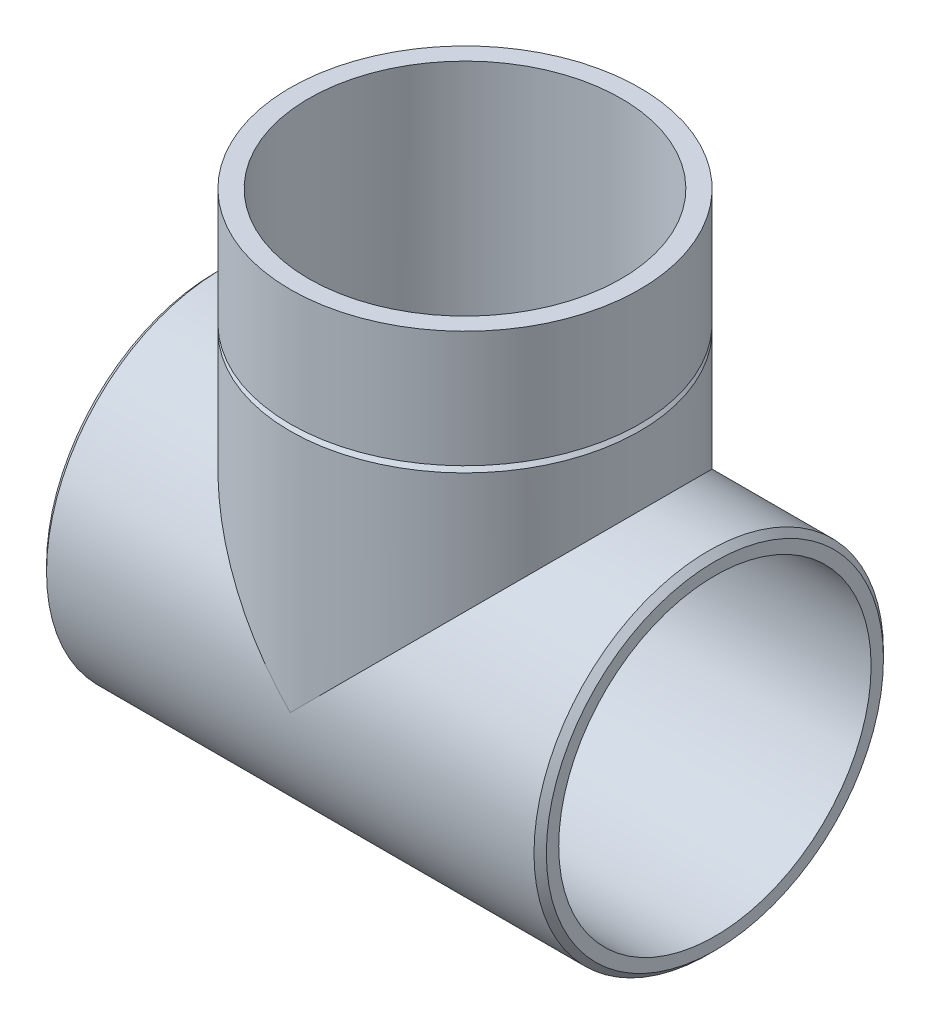
ISO-10303-21;
HEADER;
FILE_DESCRIPTION(('STEP AP214'),'2;1');
FILE_NAME('part.step','',(''),(''),'','','');
FILE_SCHEMA(('AUTOMOTIVE_DESIGN { 1 0 10303 214 1 1 1 1 }'));
ENDSEC;
DATA;
#1=APPLICATION_CONTEXT('core data for automotive mechanical design processes');
#2=APPLICATION_PROTOCOL_DEFINITION('international standard','automotive_design',2000,#1);
#3=PRODUCT_CONTEXT('',#1,'mechanical');
#4=PRODUCT('Part','Part','',(#3));
#5=PRODUCT_RELATED_PRODUCT_CATEGORY('part','',(#4));
#6=PRODUCT_DEFINITION_FORMATION('','',#4);
#7=PRODUCT_DEFINITION_CONTEXT('part definition',#1,'design');
#8=PRODUCT_DEFINITION('design','',#6,#7);
#9=PRODUCT_DEFINITION_SHAPE('','',#8);
#10=(LENGTH_UNIT() NAMED_UNIT(*) SI_UNIT(.MILLI.,.METRE.));
#11=(NAMED_UNIT(*) PLANE_ANGLE_UNIT() SI_UNIT($,.RADIAN.));
#12=(NAMED_UNIT(*) SI_UNIT($,.STERADIAN.) SOLID_ANGLE_UNIT());
#13=UNCERTAINTY_MEASURE_WITH_UNIT(LENGTH_MEASURE(1.E-05),#10,'distance_accuracy_value','');
#14=(GEOMETRIC_REPRESENTATION_CONTEXT(3) GLOBAL_UNCERTAINTY_ASSIGNED_CONTEXT((#13)) GLOBAL_UNIT_ASSIGNED_CONTEXT((#10,
#11,#12)) REPRESENTATION_CONTEXT('',''));
#15=CARTESIAN_POINT('',(0.,0.,0.));
#16=DIRECTION('',(0.,0.,1.));
#17=DIRECTION('',(1.,0.,0.));
#18=AXIS2_PLACEMENT_3D('',#15,#16,#17);
#19=CARTESIAN_POINT('',(-25.6,0.,0.));
#20=DIRECTION('',(-1.,0.,0.));
#21=DIRECTION('',(0.,0.,-1.));
#22=AXIS2_PLACEMENT_3D('',#19,#20,#21);
#23=PLANE('',#22);
#24=CARTESIAN_POINT('',(-25.6,0.,0.));
#25=DIRECTION('',(-1.,0.,0.));
#26=DIRECTION('',(0.,0.,1.));
#27=AXIS2_PLACEMENT_3D('',#24,#25,#26);
#28=CIRCLE('',#27,17.2666666666667);
#29=CARTESIAN_POINT('',(-25.6,0.,17.2666666666667));
#30=VERTEX_POINT('',#29);
#31=EDGE_CURVE('E43',#30,#30,#28,.T.);
#32=ORIENTED_EDGE('',*,*,#31,.T.);
#33=EDGE_LOOP('',(#32));
#34=FACE_BOUND('',#33,.T.);
#35=CARTESIAN_POINT('',(-25.6,0.,0.));
#36=DIRECTION('',(-1.,0.,0.));
#37=DIRECTION('',(0.,0.,1.));
#38=AXIS2_PLACEMENT_3D('',#35,#36,#37);
#39=CIRCLE('',#38,16.);
#40=CARTESIAN_POINT('',(-25.6,0.,16.));
#41=VERTEX_POINT('',#40);
#42=EDGE_CURVE('E71',#41,#41,#39,.F.);
#43=ORIENTED_EDGE('',*,*,#42,.T.);
#44=EDGE_LOOP('',(#43));
#45=FACE_BOUND('',#44,.T.);
#46=ADVANCED_FACE('F35',(#34,#45),#23,.T.);
#47=CARTESIAN_POINT('',(25.6,0.,0.));
#48=DIRECTION('',(-1.,0.,0.));
#49=DIRECTION('',(0.,0.,1.));
#50=AXIS2_PLACEMENT_3D('',#47,#48,#49);
#51=CYLINDRICAL_SURFACE('',#50,17.9);
#52=CARTESIAN_POINT('',(-24.9666666666667,0.,0.));
#53=DIRECTION('',(-1.,0.,0.));
#54=DIRECTION('',(0.,0.,1.));
#55=AXIS2_PLACEMENT_3D('',#52,#53,#54);
#56=CIRCLE('',#55,17.9);
#57=CARTESIAN_POINT('',(-24.9666666666667,0.,17.9));
#58=VERTEX_POINT('',#57);
#59=EDGE_CURVE('E89',#58,#58,#56,.F.);
#60=ORIENTED_EDGE('',*,*,#59,.T.);
#61=EDGE_LOOP('',(#60));
#62=FACE_BOUND('',#61,.T.);
#63=CARTESIAN_POINT('',(24.9666666666667,0.,0.));
#64=DIRECTION('',(1.,0.,0.));
#65=DIRECTION('',(0.,0.,-1.));
#66=AXIS2_PLACEMENT_3D('',#63,#64,#65);
#67=CIRCLE('',#66,17.9);
#68=CARTESIAN_POINT('',(24.9666666666667,0.,-17.9));
#69=VERTEX_POINT('',#68);
#70=EDGE_CURVE('E86',#69,#69,#67,.F.);
#71=ORIENTED_EDGE('',*,*,#70,.T.);
#72=EDGE_LOOP('',(#71));
#73=FACE_BOUND('',#72,.T.);
#74=CARTESIAN_POINT('',(0.,0.,0.));
#75=DIRECTION('',(-0.707106781186547,-0.707106781186547,0.));
#76=DIRECTION('',(-0.707106781186547,0.707106781186547,0.));
#77=AXIS2_PLACEMENT_3D('',#74,#75,#76);
#78=ELLIPSE('',#77,25.3144227664784,17.9);
#79=CARTESIAN_POINT('',(0.,0.,-17.9));
#80=VERTEX_POINT('',#79);
#81=CARTESIAN_POINT('',(0.,0.,17.9));
#82=VERTEX_POINT('',#81);
#83=EDGE_CURVE('E52',#80,#82,#78,.F.);
#84=ORIENTED_EDGE('',*,*,#83,.F.);
#85=CARTESIAN_POINT('',(0.,0.,0.));
#86=DIRECTION('',(-0.707106781186547,0.707106781186547,0.));
#87=DIRECTION('',(-0.707106781186547,-0.707106781186547,0.));
#88=AXIS2_PLACEMENT_3D('',#85,#86,#87);
#89=ELLIPSE('',#88,25.3144227664784,17.9);
#90=EDGE_CURVE('E49',#82,#80,#89,.T.);
#91=ORIENTED_EDGE('',*,*,#90,.F.);
#92=EDGE_LOOP('',(#84,#91));
#93=FACE_BOUND('',#92,.T.);
#94=ADVANCED_FACE('F102',(#62,#73,#93),#51,.T.);
#95=CARTESIAN_POINT('',(25.6,0.,0.));
#96=DIRECTION('',(1.,0.,0.));
#97=DIRECTION('',(0.,0.,-1.));
#98=AXIS2_PLACEMENT_3D('',#95,#96,#97);
#99=PLANE('',#98);
#100=CARTESIAN_POINT('',(25.6,0.,0.));
#101=DIRECTION('',(1.,0.,0.));
#102=DIRECTION('',(0.,0.,-1.));
#103=AXIS2_PLACEMENT_3D('',#100,#101,#102);
#104=CIRCLE('',#103,17.2666666666667);
#105=CARTESIAN_POINT('',(25.6,0.,-17.2666666666667));
#106=VERTEX_POINT('',#105);
#107=EDGE_CURVE('E11',#106,#106,#104,.T.);
#108=ORIENTED_EDGE('',*,*,#107,.T.);
#109=EDGE_LOOP('',(#108));
#110=FACE_BOUND('',#109,.T.);
#111=CARTESIAN_POINT('',(25.6,0.,0.));
#112=DIRECTION('',(1.,0.,0.));
#113=DIRECTION('',(0.,0.,-1.));
#114=AXIS2_PLACEMENT_3D('',#111,#112,#113);
#115=CIRCLE('',#114,16.);
#116=CARTESIAN_POINT('',(25.6,0.,-16.));
#117=VERTEX_POINT('',#116);
#118=EDGE_CURVE('E68',#117,#117,#115,.T.);
#119=ORIENTED_EDGE('',*,*,#118,.F.);
#120=EDGE_LOOP('',(#119));
#121=FACE_BOUND('',#120,.T.);
#122=ADVANCED_FACE('F105',(#110,#121),#99,.T.);
#123=CARTESIAN_POINT('',(0.,25.6,0.));
#124=DIRECTION('',(0.,-1.,0.));
#125=DIRECTION('',(0.,0.,-1.));
#126=AXIS2_PLACEMENT_3D('',#123,#124,#125);
#127=CYLINDRICAL_SURFACE('',#126,17.9);
#128=CARTESIAN_POINT('',(0.,24.9666666666667,0.));
#129=DIRECTION('',(0.,1.,0.));
#130=DIRECTION('',(0.,0.,1.));
#131=AXIS2_PLACEMENT_3D('',#128,#129,#130);
#132=CIRCLE('',#131,17.9);
#133=CARTESIAN_POINT('',(0.,24.9666666666667,17.9));
#134=VERTEX_POINT('',#133);
#135=EDGE_CURVE('E83',#134,#134,#132,.F.);
#136=ORIENTED_EDGE('',*,*,#135,.T.);
#137=EDGE_LOOP('',(#136));
#138=FACE_BOUND('',#137,.T.);
#139=ORIENTED_EDGE('',*,*,#90,.T.);
#140=ORIENTED_EDGE('',*,*,#83,.T.);
#141=EDGE_LOOP('',(#139,#140));
#142=FACE_BOUND('',#141,.T.);
#143=ADVANCED_FACE('F116',(#138,#142),#127,.T.);
#144=CARTESIAN_POINT('',(25.6,0.,0.));
#145=DIRECTION('',(-1.,0.,0.));
#146=DIRECTION('',(0.,0.,1.));
#147=AXIS2_PLACEMENT_3D('',#144,#145,#146);
#148=CYLINDRICAL_SURFACE('',#147,16.);
#149=ORIENTED_EDGE('',*,*,#42,.F.);
#150=EDGE_LOOP('',(#149));
#151=FACE_BOUND('',#150,.T.);
#152=ORIENTED_EDGE('',*,*,#118,.T.);
#153=EDGE_LOOP('',(#152));
#154=FACE_BOUND('',#153,.T.);
#155=CARTESIAN_POINT('',(0.,0.,0.));
#156=DIRECTION('',(-0.707106781186547,-0.707106781186547,0.));
#157=DIRECTION('',(-0.707106781186547,0.707106781186547,0.));
#158=AXIS2_PLACEMENT_3D('',#155,#156,#157);
#159=ELLIPSE('',#158,22.6274169979695,16.);
#160=CARTESIAN_POINT('',(0.,0.,-16.));
#161=VERTEX_POINT('',#160);
#162=CARTESIAN_POINT('',(0.,0.,16.));
#163=VERTEX_POINT('',#162);
#164=EDGE_CURVE('E60',#161,#163,#159,.F.);
#165=ORIENTED_EDGE('',*,*,#164,.T.);
#166=CARTESIAN_POINT('',(0.,0.,0.));
#167=DIRECTION('',(-0.707106781186547,0.707106781186547,0.));
#168=DIRECTION('',(-0.707106781186547,-0.707106781186547,0.));
#169=AXIS2_PLACEMENT_3D('',#166,#167,#168);
#170=ELLIPSE('',#169,22.6274169979695,16.);
#171=EDGE_CURVE('E64',#163,#161,#170,.T.);
#172=ORIENTED_EDGE('',*,*,#171,.T.);
#173=EDGE_LOOP('',(#165,#172));
#174=FACE_BOUND('',#173,.T.);
#175=ADVANCED_FACE('F67',(#151,#154,#174),#148,.F.);
#176=CARTESIAN_POINT('',(0.,25.6,0.));
#177=DIRECTION('',(0.,-1.,0.));
#178=DIRECTION('',(0.,0.,-1.));
#179=AXIS2_PLACEMENT_3D('',#176,#177,#178);
#180=CYLINDRICAL_SURFACE('',#179,16.);
#181=ORIENTED_EDGE('',*,*,#171,.F.);
#182=ORIENTED_EDGE('',*,*,#164,.F.);
#183=EDGE_LOOP('',(#181,#182));
#184=FACE_BOUND('',#183,.T.);
#185=CARTESIAN_POINT('',(0.,37.5333333333333,0.));
#186=DIRECTION('',(0.,1.,0.));
#187=DIRECTION('',(0.,0.,1.));
#188=AXIS2_PLACEMENT_3D('',#185,#186,#187);
#189=CIRCLE('',#188,16.);
#190=CARTESIAN_POINT('',(0.,37.5333333333333,16.));
#191=VERTEX_POINT('',#190);
#192=EDGE_CURVE('E154',#191,#191,#189,.T.);
#193=ORIENTED_EDGE('',*,*,#192,.T.);
#194=EDGE_LOOP('',(#193));
#195=FACE_BOUND('',#194,.T.);
#196=ADVANCED_FACE('F62',(#184,#195),#180,.F.);
#197=CARTESIAN_POINT('',(0.,25.6,0.));
#198=DIRECTION('',(0.,-1.,0.));
#199=DIRECTION('',(0.,0.,-1.));
#200=AXIS2_PLACEMENT_3D('',#197,#198,#199);
#201=CONICAL_SURFACE('',#200,17.2666666666667,0.785398163397454);
#202=ORIENTED_EDGE('',*,*,#135,.F.);
#203=EDGE_LOOP('',(#202));
#204=FACE_BOUND('',#203,.T.);
#205=CARTESIAN_POINT('',(0.,25.6,0.));
#206=DIRECTION('',(0.,1.,0.));
#207=DIRECTION('',(0.,0.,1.));
#208=AXIS2_PLACEMENT_3D('',#205,#206,#207);
#209=CIRCLE('',#208,17.2666666666667);
#210=CARTESIAN_POINT('',(0.,25.6,17.2666666666667));
#211=VERTEX_POINT('',#210);
#212=EDGE_CURVE('E80',#211,#211,#209,.T.);
#213=ORIENTED_EDGE('',*,*,#212,.F.);
#214=EDGE_LOOP('',(#213));
#215=FACE_BOUND('',#214,.T.);
#216=ADVANCED_FACE('F99',(#204,#215),#201,.T.);
#217=CARTESIAN_POINT('',(-24.9666666666667,0.,0.));
#218=DIRECTION('',(1.,0.,0.));
#219=DIRECTION('',(0.,0.,-1.));
#220=AXIS2_PLACEMENT_3D('',#217,#218,#219);
#221=CONICAL_SURFACE('',#220,17.9,0.785398163397451);
#222=ORIENTED_EDGE('',*,*,#31,.F.);
#223=EDGE_LOOP('',(#222));
#224=FACE_BOUND('',#223,.T.);
#225=ORIENTED_EDGE('',*,*,#59,.F.);
#226=EDGE_LOOP('',(#225));
#227=FACE_BOUND('',#226,.T.);
#228=ADVANCED_FACE('F96',(#224,#227),#221,.T.);
#229=CARTESIAN_POINT('',(25.6,0.,0.));
#230=DIRECTION('',(-1.,0.,0.));
#231=DIRECTION('',(0.,0.,1.));
#232=AXIS2_PLACEMENT_3D('',#229,#230,#231);
#233=CONICAL_SURFACE('',#232,17.2666666666667,0.785398163397454);
#234=ORIENTED_EDGE('',*,*,#70,.F.);
#235=EDGE_LOOP('',(#234));
#236=FACE_BOUND('',#235,.T.);
#237=ORIENTED_EDGE('',*,*,#107,.F.);
#238=EDGE_LOOP('',(#237));
#239=FACE_BOUND('',#238,.T.);
#240=ADVANCED_FACE('F37',(#236,#239),#233,.T.);
#241=CARTESIAN_POINT('',(0.,37.5333333333333,0.));
#242=DIRECTION('',(0.,1.,0.));
#243=DIRECTION('',(0.,0.,1.));
#244=AXIS2_PLACEMENT_3D('',#241,#242,#243);
#245=PLANE('',#244);
#246=CARTESIAN_POINT('',(0.,37.5333333333333,0.));
#247=DIRECTION('',(0.,1.,0.));
#248=DIRECTION('',(0.,0.,1.));
#249=AXIS2_PLACEMENT_3D('',#246,#247,#248);
#250=CIRCLE('',#249,17.9);
#251=CARTESIAN_POINT('',(0.,37.5333333333333,17.9));
#252=VERTEX_POINT('',#251);
#253=EDGE_CURVE('E76',#252,#252,#250,.T.);
#254=ORIENTED_EDGE('',*,*,#253,.T.);
#255=EDGE_LOOP('',(#254));
#256=FACE_BOUND('',#255,.T.);
#257=ORIENTED_EDGE('',*,*,#192,.F.);
#258=EDGE_LOOP('',(#257));
#259=FACE_BOUND('',#258,.T.);
#260=ADVANCED_FACE('F111',(#256,#259),#245,.T.);
#261=CARTESIAN_POINT('',(0.,25.6,0.));
#262=DIRECTION('',(0.,1.,0.));
#263=DIRECTION('',(0.,0.,1.));
#264=AXIS2_PLACEMENT_3D('',#261,#262,#263);
#265=PLANE('',#264);
#266=ORIENTED_EDGE('',*,*,#212,.T.);
#267=EDGE_LOOP('',(#266));
#268=FACE_BOUND('',#267,.T.);
#269=CARTESIAN_POINT('',(0.,25.6,0.));
#270=DIRECTION('',(0.,1.,0.));
#271=DIRECTION('',(0.,0.,1.));
#272=AXIS2_PLACEMENT_3D('',#269,#270,#271);
#273=CIRCLE('',#272,17.9);
#274=CARTESIAN_POINT('',(0.,25.6,17.9));
#275=VERTEX_POINT('',#274);
#276=EDGE_CURVE('E152',#275,#275,#273,.T.);
#277=ORIENTED_EDGE('',*,*,#276,.F.);
#278=EDGE_LOOP('',(#277));
#279=FACE_BOUND('',#278,.T.);
#280=ADVANCED_FACE('F145',(#268,#279),#265,.F.);
#281=CARTESIAN_POINT('',(0.,37.5333333333333,0.));
#282=DIRECTION('',(0.,-1.,0.));
#283=DIRECTION('',(0.,0.,-1.));
#284=AXIS2_PLACEMENT_3D('',#281,#282,#283);
#285=CYLINDRICAL_SURFACE('',#284,17.9);
#286=ORIENTED_EDGE('',*,*,#253,.F.);
#287=EDGE_LOOP('',(#286));
#288=FACE_BOUND('',#287,.T.);
#289=ORIENTED_EDGE('',*,*,#276,.T.);
#290=EDGE_LOOP('',(#289));
#291=FACE_BOUND('',#290,.T.);
#292=ADVANCED_FACE('F148',(#288,#291),#285,.T.);
#293=CLOSED_SHELL('',(#46,#94,#122,#143,#175,#196,#216,#228,#240,#260,#280,#292));
#294=MANIFOLD_SOLID_BREP('B2',#293);
#295=ADVANCED_BREP_SHAPE_REPRESENTATION('',(#18,#294),#14);
#296=SHAPE_DEFINITION_REPRESENTATION(#9,#295);
ENDSEC;
END-ISO-10303-21;
